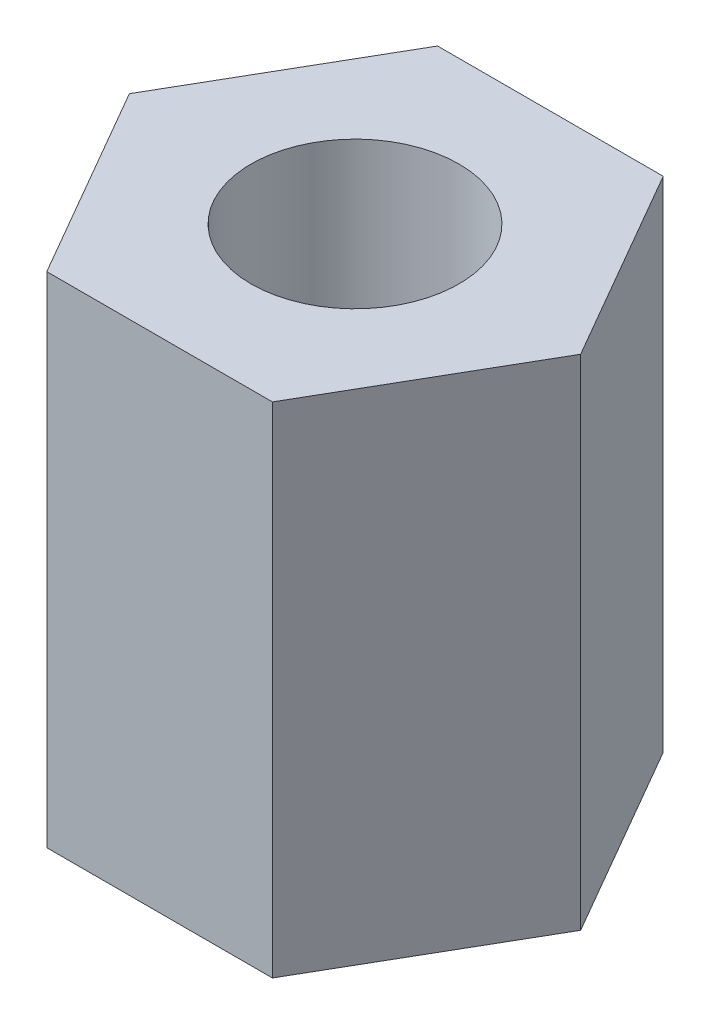
ISO-10303-21;
HEADER;
FILE_DESCRIPTION(('STEP AP214'),'2;1');
FILE_NAME('part.step','',(''),(''),'','','');
FILE_SCHEMA(('AUTOMOTIVE_DESIGN { 1 0 10303 214 1 1 1 1 }'));
ENDSEC;
DATA;
#1=APPLICATION_CONTEXT('core data for automotive mechanical design processes');
#2=APPLICATION_PROTOCOL_DEFINITION('international standard','automotive_design',2000,#1);
#3=PRODUCT_CONTEXT('',#1,'mechanical');
#4=PRODUCT('Part','Part','',(#3));
#5=PRODUCT_RELATED_PRODUCT_CATEGORY('part','',(#4));
#6=PRODUCT_DEFINITION_FORMATION('','',#4);
#7=PRODUCT_DEFINITION_CONTEXT('part definition',#1,'design');
#8=PRODUCT_DEFINITION('design','',#6,#7);
#9=PRODUCT_DEFINITION_SHAPE('','',#8);
#10=(LENGTH_UNIT() NAMED_UNIT(*) SI_UNIT(.MILLI.,.METRE.));
#11=(NAMED_UNIT(*) PLANE_ANGLE_UNIT() SI_UNIT($,.RADIAN.));
#12=(NAMED_UNIT(*) SI_UNIT($,.STERADIAN.) SOLID_ANGLE_UNIT());
#13=UNCERTAINTY_MEASURE_WITH_UNIT(LENGTH_MEASURE(1.E-05),#10,'distance_accuracy_value','');
#14=(GEOMETRIC_REPRESENTATION_CONTEXT(3) GLOBAL_UNCERTAINTY_ASSIGNED_CONTEXT((#13)) GLOBAL_UNIT_ASSIGNED_CONTEXT((#10,
#11,#12)) REPRESENTATION_CONTEXT('',''));
#15=CARTESIAN_POINT('',(0.,0.,0.));
#16=DIRECTION('',(0.,0.,1.));
#17=DIRECTION('',(1.,0.,0.));
#18=AXIS2_PLACEMENT_3D('',#15,#16,#17);
#19=CARTESIAN_POINT('',(0.,6.,0.));
#20=DIRECTION('',(0.,1.,0.));
#21=DIRECTION('',(0.,0.,1.));
#22=AXIS2_PLACEMENT_3D('',#19,#20,#21);
#23=PLANE('',#22);
#24=DIRECTION('',(0.499999999999995,0.,-0.866025403784441));
#25=VECTOR('',#24,1.);
#26=CARTESIAN_POINT('',(1.35677313259565,6.,2.34999999999999));
#27=LINE('',#26,#25);
#28=CARTESIAN_POINT('',(1.35677313259565,6.,2.34999999999999));
#29=VERTEX_POINT('',#28);
#30=CARTESIAN_POINT('',(2.71354626519124,6.,0.));
#31=VERTEX_POINT('',#30);
#32=EDGE_CURVE('E135',#29,#31,#27,.T.);
#33=ORIENTED_EDGE('',*,*,#32,.T.);
#34=DIRECTION('',(-0.500000000000001,0.,-0.866025403784438));
#35=VECTOR('',#34,1.);
#36=CARTESIAN_POINT('',(2.71354626519124,6.,0.));
#37=LINE('',#36,#35);
#38=CARTESIAN_POINT('',(1.35677313259562,6.,-2.35));
#39=VERTEX_POINT('',#38);
#40=EDGE_CURVE('E93',#31,#39,#37,.T.);
#41=ORIENTED_EDGE('',*,*,#40,.T.);
#42=DIRECTION('',(-1.,0.,0.));
#43=VECTOR('',#42,1.);
#44=CARTESIAN_POINT('',(1.35677313259562,6.,-2.35));
#45=LINE('',#44,#43);
#46=CARTESIAN_POINT('',(-1.35677313259563,6.,-2.35));
#47=VERTEX_POINT('',#46);
#48=EDGE_CURVE('E106',#39,#47,#45,.T.);
#49=ORIENTED_EDGE('',*,*,#48,.T.);
#50=DIRECTION('',(-0.499999999999995,0.,0.866025403784441));
#51=VECTOR('',#50,1.);
#52=CARTESIAN_POINT('',(-1.35677313259563,6.,-2.35));
#53=LINE('',#52,#51);
#54=CARTESIAN_POINT('',(-2.71354626519124,6.,0.));
#55=VERTEX_POINT('',#54);
#56=EDGE_CURVE('E100',#47,#55,#53,.T.);
#57=ORIENTED_EDGE('',*,*,#56,.T.);
#58=DIRECTION('',(0.500000000000007,0.,0.866025403784435));
#59=VECTOR('',#58,1.);
#60=CARTESIAN_POINT('',(-2.71354626519124,6.,0.));
#61=LINE('',#60,#59);
#62=CARTESIAN_POINT('',(-1.3567731325956,6.,2.35000000000001));
#63=VERTEX_POINT('',#62);
#64=EDGE_CURVE('E104',#55,#63,#61,.T.);
#65=ORIENTED_EDGE('',*,*,#64,.T.);
#66=DIRECTION('',(1.,0.,0.));
#67=VECTOR('',#66,1.);
#68=CARTESIAN_POINT('',(-1.3567731325956,6.,2.35000000000001));
#69=LINE('',#68,#67);
#70=EDGE_CURVE('E56',#63,#29,#69,.T.);
#71=ORIENTED_EDGE('',*,*,#70,.T.);
#72=EDGE_LOOP('',(#33,#41,#49,#57,#65,#71));
#73=FACE_BOUND('',#72,.T.);
#74=CARTESIAN_POINT('',(0.,6.,0.));
#75=DIRECTION('',(0.,1.,0.));
#76=DIRECTION('',(0.,0.,1.));
#77=AXIS2_PLACEMENT_3D('',#74,#75,#76);
#78=CIRCLE('',#77,1.25);
#79=CARTESIAN_POINT('',(0.,6.,1.25));
#80=VERTEX_POINT('',#79);
#81=EDGE_CURVE('E128',#80,#80,#78,.T.);
#82=ORIENTED_EDGE('',*,*,#81,.F.);
#83=EDGE_LOOP('',(#82));
#84=FACE_BOUND('',#83,.T.);
#85=ADVANCED_FACE('F39',(#73,#84),#23,.T.);
#86=CARTESIAN_POINT('',(0.,0.,0.));
#87=DIRECTION('',(0.,1.,0.));
#88=DIRECTION('',(0.,0.,1.));
#89=AXIS2_PLACEMENT_3D('',#86,#87,#88);
#90=PLANE('',#89);
#91=DIRECTION('',(0.499999999999995,0.,-0.866025403784441));
#92=VECTOR('',#91,1.);
#93=CARTESIAN_POINT('',(1.35677313259565,0.,2.34999999999999));
#94=LINE('',#93,#92);
#95=CARTESIAN_POINT('',(1.35677313259565,0.,2.34999999999999));
#96=VERTEX_POINT('',#95);
#97=CARTESIAN_POINT('',(2.71354626519124,0.,0.));
#98=VERTEX_POINT('',#97);
#99=EDGE_CURVE('E124',#96,#98,#94,.T.);
#100=ORIENTED_EDGE('',*,*,#99,.F.);
#101=DIRECTION('',(1.,0.,0.));
#102=VECTOR('',#101,1.);
#103=CARTESIAN_POINT('',(-1.3567731325956,0.,2.35000000000001));
#104=LINE('',#103,#102);
#105=CARTESIAN_POINT('',(-1.3567731325956,0.,2.35000000000001));
#106=VERTEX_POINT('',#105);
#107=EDGE_CURVE('E85',#106,#96,#104,.T.);
#108=ORIENTED_EDGE('',*,*,#107,.F.);
#109=DIRECTION('',(0.500000000000007,0.,0.866025403784435));
#110=VECTOR('',#109,1.);
#111=CARTESIAN_POINT('',(-2.71354626519124,0.,0.));
#112=LINE('',#111,#110);
#113=CARTESIAN_POINT('',(-2.71354626519124,0.,0.));
#114=VERTEX_POINT('',#113);
#115=EDGE_CURVE('E79',#114,#106,#112,.T.);
#116=ORIENTED_EDGE('',*,*,#115,.F.);
#117=DIRECTION('',(-0.499999999999995,0.,0.866025403784441));
#118=VECTOR('',#117,1.);
#119=CARTESIAN_POINT('',(-1.35677313259563,0.,-2.35));
#120=LINE('',#119,#118);
#121=CARTESIAN_POINT('',(-1.35677313259563,0.,-2.35));
#122=VERTEX_POINT('',#121);
#123=EDGE_CURVE('E114',#122,#114,#120,.T.);
#124=ORIENTED_EDGE('',*,*,#123,.F.);
#125=DIRECTION('',(-1.,0.,0.));
#126=VECTOR('',#125,1.);
#127=CARTESIAN_POINT('',(1.35677313259562,0.,-2.35));
#128=LINE('',#127,#126);
#129=CARTESIAN_POINT('',(1.35677313259562,0.,-2.35));
#130=VERTEX_POINT('',#129);
#131=EDGE_CURVE('E130',#130,#122,#128,.T.);
#132=ORIENTED_EDGE('',*,*,#131,.F.);
#133=DIRECTION('',(-0.500000000000001,0.,-0.866025403784438));
#134=VECTOR('',#133,1.);
#135=CARTESIAN_POINT('',(2.71354626519124,0.,0.));
#136=LINE('',#135,#134);
#137=EDGE_CURVE('E127',#98,#130,#136,.T.);
#138=ORIENTED_EDGE('',*,*,#137,.F.);
#139=EDGE_LOOP('',(#100,#108,#116,#124,#132,#138));
#140=FACE_BOUND('',#139,.T.);
#141=CARTESIAN_POINT('',(0.,0.,0.));
#142=DIRECTION('',(0.,1.,0.));
#143=DIRECTION('',(0.,0.,1.));
#144=AXIS2_PLACEMENT_3D('',#141,#142,#143);
#145=CIRCLE('',#144,1.25);
#146=CARTESIAN_POINT('',(0.,0.,1.25));
#147=VERTEX_POINT('',#146);
#148=EDGE_CURVE('E228',#147,#147,#145,.T.);
#149=ORIENTED_EDGE('',*,*,#148,.T.);
#150=EDGE_LOOP('',(#149));
#151=FACE_BOUND('',#150,.T.);
#152=ADVANCED_FACE('F144',(#140,#151),#90,.F.);
#153=CARTESIAN_POINT('',(1.35677313259565,6.,2.34999999999999));
#154=DIRECTION('',(-0.866025403784441,0.,-0.499999999999995));
#155=DIRECTION('',(-0.499999999999995,0.,0.866025403784441));
#156=AXIS2_PLACEMENT_3D('',#153,#154,#155);
#157=PLANE('',#156);
#158=ORIENTED_EDGE('',*,*,#99,.T.);
#159=DIRECTION('',(0.,-1.,0.));
#160=VECTOR('',#159,1.);
#161=CARTESIAN_POINT('',(2.71354626519124,6.,0.));
#162=LINE('',#161,#160);
#163=EDGE_CURVE('E11',#31,#98,#162,.T.);
#164=ORIENTED_EDGE('',*,*,#163,.F.);
#165=ORIENTED_EDGE('',*,*,#32,.F.);
#166=DIRECTION('',(0.,-1.,0.));
#167=VECTOR('',#166,1.);
#168=CARTESIAN_POINT('',(1.35677313259565,6.,2.34999999999999));
#169=LINE('',#168,#167);
#170=EDGE_CURVE('E120',#29,#96,#169,.T.);
#171=ORIENTED_EDGE('',*,*,#170,.T.);
#172=EDGE_LOOP('',(#158,#164,#165,#171));
#173=FACE_BOUND('',#172,.T.);
#174=ADVANCED_FACE('F41',(#173),#157,.F.);
#175=CARTESIAN_POINT('',(2.71354626519124,6.,0.));
#176=DIRECTION('',(-0.866025403784438,0.,0.500000000000001));
#177=DIRECTION('',(0.500000000000001,0.,0.866025403784438));
#178=AXIS2_PLACEMENT_3D('',#175,#176,#177);
#179=PLANE('',#178);
#180=ORIENTED_EDGE('',*,*,#137,.T.);
#181=DIRECTION('',(0.,-1.,0.));
#182=VECTOR('',#181,1.);
#183=CARTESIAN_POINT('',(1.35677313259562,6.,-2.35));
#184=LINE('',#183,#182);
#185=EDGE_CURVE('E48',#39,#130,#184,.T.);
#186=ORIENTED_EDGE('',*,*,#185,.F.);
#187=ORIENTED_EDGE('',*,*,#40,.F.);
#188=ORIENTED_EDGE('',*,*,#163,.T.);
#189=EDGE_LOOP('',(#180,#186,#187,#188));
#190=FACE_BOUND('',#189,.T.);
#191=ADVANCED_FACE('F169',(#190),#179,.F.);
#192=CARTESIAN_POINT('',(1.35677313259562,6.,-2.35));
#193=DIRECTION('',(0.,0.,1.));
#194=DIRECTION('',(1.,0.,0.));
#195=AXIS2_PLACEMENT_3D('',#192,#193,#194);
#196=PLANE('',#195);
#197=ORIENTED_EDGE('',*,*,#131,.T.);
#198=DIRECTION('',(0.,-1.,0.));
#199=VECTOR('',#198,1.);
#200=CARTESIAN_POINT('',(-1.35677313259563,6.,-2.35));
#201=LINE('',#200,#199);
#202=EDGE_CURVE('E115',#47,#122,#201,.T.);
#203=ORIENTED_EDGE('',*,*,#202,.F.);
#204=ORIENTED_EDGE('',*,*,#48,.F.);
#205=ORIENTED_EDGE('',*,*,#185,.T.);
#206=EDGE_LOOP('',(#197,#203,#204,#205));
#207=FACE_BOUND('',#206,.T.);
#208=ADVANCED_FACE('F141',(#207),#196,.F.);
#209=CARTESIAN_POINT('',(-1.35677313259563,6.,-2.35));
#210=DIRECTION('',(0.866025403784442,0.,0.499999999999995));
#211=DIRECTION('',(0.499999999999995,0.,-0.866025403784442));
#212=AXIS2_PLACEMENT_3D('',#209,#210,#211);
#213=PLANE('',#212);
#214=ORIENTED_EDGE('',*,*,#123,.T.);
#215=DIRECTION('',(0.,-1.,0.));
#216=VECTOR('',#215,1.);
#217=CARTESIAN_POINT('',(-2.71354626519124,6.,0.));
#218=LINE('',#217,#216);
#219=EDGE_CURVE('E111',#55,#114,#218,.T.);
#220=ORIENTED_EDGE('',*,*,#219,.F.);
#221=ORIENTED_EDGE('',*,*,#56,.F.);
#222=ORIENTED_EDGE('',*,*,#202,.T.);
#223=EDGE_LOOP('',(#214,#220,#221,#222));
#224=FACE_BOUND('',#223,.T.);
#225=ADVANCED_FACE('F112',(#224),#213,.F.);
#226=CARTESIAN_POINT('',(-2.71354626519124,6.,0.));
#227=DIRECTION('',(0.866025403784434,0.,-0.500000000000007));
#228=DIRECTION('',(-0.500000000000007,0.,-0.866025403784435));
#229=AXIS2_PLACEMENT_3D('',#226,#227,#228);
#230=PLANE('',#229);
#231=ORIENTED_EDGE('',*,*,#115,.T.);
#232=DIRECTION('',(0.,-1.,0.));
#233=VECTOR('',#232,1.);
#234=CARTESIAN_POINT('',(-1.3567731325956,6.,2.35000000000001));
#235=LINE('',#234,#233);
#236=EDGE_CURVE('E116',#63,#106,#235,.T.);
#237=ORIENTED_EDGE('',*,*,#236,.F.);
#238=ORIENTED_EDGE('',*,*,#64,.F.);
#239=ORIENTED_EDGE('',*,*,#219,.T.);
#240=EDGE_LOOP('',(#231,#237,#238,#239));
#241=FACE_BOUND('',#240,.T.);
#242=ADVANCED_FACE('F118',(#241),#230,.F.);
#243=CARTESIAN_POINT('',(-1.3567731325956,6.,2.35000000000001));
#244=DIRECTION('',(0.,0.,-1.));
#245=DIRECTION('',(-1.,0.,0.));
#246=AXIS2_PLACEMENT_3D('',#243,#244,#245);
#247=PLANE('',#246);
#248=ORIENTED_EDGE('',*,*,#107,.T.);
#249=ORIENTED_EDGE('',*,*,#170,.F.);
#250=ORIENTED_EDGE('',*,*,#70,.F.);
#251=ORIENTED_EDGE('',*,*,#236,.T.);
#252=EDGE_LOOP('',(#248,#249,#250,#251));
#253=FACE_BOUND('',#252,.T.);
#254=ADVANCED_FACE('F149',(#253),#247,.F.);
#255=CARTESIAN_POINT('',(0.,6.,0.));
#256=DIRECTION('',(0.,-1.,0.));
#257=DIRECTION('',(0.,0.,-1.));
#258=AXIS2_PLACEMENT_3D('',#255,#256,#257);
#259=CYLINDRICAL_SURFACE('',#258,1.25);
#260=ORIENTED_EDGE('',*,*,#81,.T.);
#261=EDGE_LOOP('',(#260));
#262=FACE_BOUND('',#261,.T.);
#263=ORIENTED_EDGE('',*,*,#148,.F.);
#264=EDGE_LOOP('',(#263));
#265=FACE_BOUND('',#264,.T.);
#266=ADVANCED_FACE('F151',(#262,#265),#259,.F.);
#267=CLOSED_SHELL('',(#85,#152,#174,#191,#208,#225,#242,#254,#266));
#268=MANIFOLD_SOLID_BREP('B2',#267);
#269=ADVANCED_BREP_SHAPE_REPRESENTATION('',(#18,#268),#14);
#270=SHAPE_DEFINITION_REPRESENTATION(#9,#269);
ENDSEC;
END-ISO-10303-21;
